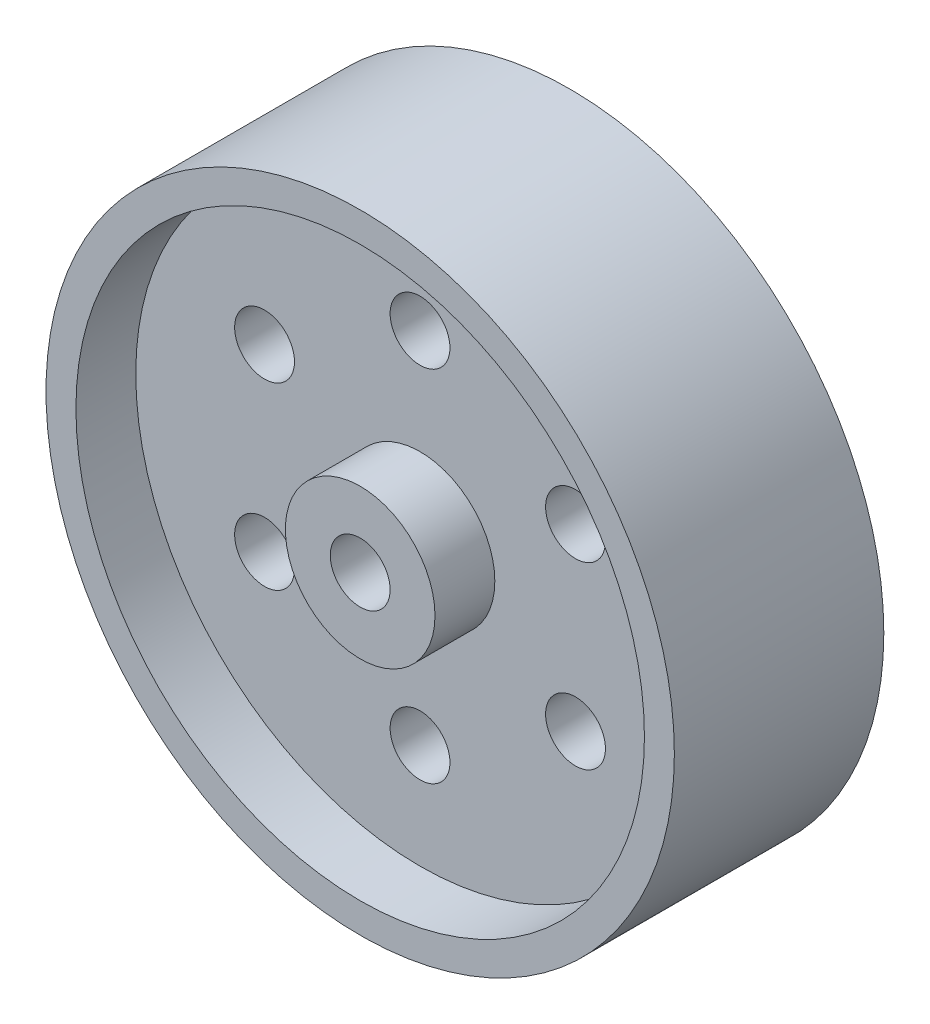
ISO-10303-21;
HEADER;
FILE_DESCRIPTION(('STEP AP214'),'2;1');
FILE_NAME('part.step','',(''),(''),'','','');
FILE_SCHEMA(('AUTOMOTIVE_DESIGN { 1 0 10303 214 1 1 1 1 }'));
ENDSEC;
DATA;
#1=APPLICATION_CONTEXT('core data for automotive mechanical design processes');
#2=APPLICATION_PROTOCOL_DEFINITION('international standard','automotive_design',2000,#1);
#3=PRODUCT_CONTEXT('',#1,'mechanical');
#4=PRODUCT('Part','Part','',(#3));
#5=PRODUCT_RELATED_PRODUCT_CATEGORY('part','',(#4));
#6=PRODUCT_DEFINITION_FORMATION('','',#4);
#7=PRODUCT_DEFINITION_CONTEXT('part definition',#1,'design');
#8=PRODUCT_DEFINITION('design','',#6,#7);
#9=PRODUCT_DEFINITION_SHAPE('','',#8);
#10=(LENGTH_UNIT() NAMED_UNIT(*) SI_UNIT(.MILLI.,.METRE.));
#11=(NAMED_UNIT(*) PLANE_ANGLE_UNIT() SI_UNIT($,.RADIAN.));
#12=(NAMED_UNIT(*) SI_UNIT($,.STERADIAN.) SOLID_ANGLE_UNIT());
#13=UNCERTAINTY_MEASURE_WITH_UNIT(LENGTH_MEASURE(1.E-05),#10,'distance_accuracy_value','');
#14=(GEOMETRIC_REPRESENTATION_CONTEXT(3) GLOBAL_UNCERTAINTY_ASSIGNED_CONTEXT((#13)) GLOBAL_UNIT_ASSIGNED_CONTEXT((#10,
#11,#12)) REPRESENTATION_CONTEXT('',''));
#15=CARTESIAN_POINT('',(0.,0.,0.));
#16=DIRECTION('',(0.,0.,1.));
#17=DIRECTION('',(1.,0.,0.));
#18=AXIS2_PLACEMENT_3D('',#15,#16,#17);
#19=CARTESIAN_POINT('',(0.,0.,26.8716640502355));
#20=DIRECTION('',(0.,0.,1.));
#21=DIRECTION('',(1.,0.,0.));
#22=AXIS2_PLACEMENT_3D('',#19,#20,#21);
#23=CYLINDRICAL_SURFACE('',#22,5.);
#24=CARTESIAN_POINT('',(0.,0.,7.));
#25=DIRECTION('',(0.,0.,1.));
#26=DIRECTION('',(1.,0.,0.));
#27=AXIS2_PLACEMENT_3D('',#24,#25,#26);
#28=CIRCLE('',#27,5.);
#29=CARTESIAN_POINT('',(5.,0.,7.));
#30=VERTEX_POINT('',#29);
#31=EDGE_CURVE('E10',#30,#30,#28,.T.);
#32=ORIENTED_EDGE('',*,*,#31,.F.);
#33=EDGE_LOOP('',(#32));
#34=FACE_BOUND('',#33,.T.);
#35=CARTESIAN_POINT('',(0.,0.,3.));
#36=DIRECTION('',(0.,0.,1.));
#37=DIRECTION('',(1.,0.,0.));
#38=AXIS2_PLACEMENT_3D('',#35,#36,#37);
#39=CIRCLE('',#38,5.);
#40=CARTESIAN_POINT('',(5.,0.,3.));
#41=VERTEX_POINT('',#40);
#42=EDGE_CURVE('E83',#41,#41,#39,.T.);
#43=ORIENTED_EDGE('',*,*,#42,.T.);
#44=EDGE_LOOP('',(#43));
#45=FACE_BOUND('',#44,.T.);
#46=ADVANCED_FACE('F35',(#34,#45),#23,.T.);
#47=CARTESIAN_POINT('',(0.,2.,7.));
#48=DIRECTION('',(0.,0.,-1.));
#49=DIRECTION('',(-1.,0.,0.));
#50=AXIS2_PLACEMENT_3D('',#47,#48,#49);
#51=PLANE('',#50);
#52=CARTESIAN_POINT('',(0.,0.,7.));
#53=DIRECTION('',(0.,0.,1.));
#54=DIRECTION('',(1.,0.,0.));
#55=AXIS2_PLACEMENT_3D('',#52,#53,#54);
#56=CIRCLE('',#55,2.);
#57=CARTESIAN_POINT('',(2.,0.,7.));
#58=VERTEX_POINT('',#57);
#59=EDGE_CURVE('E42',#58,#58,#56,.T.);
#60=ORIENTED_EDGE('',*,*,#59,.F.);
#61=EDGE_LOOP('',(#60));
#62=FACE_BOUND('',#61,.T.);
#63=ORIENTED_EDGE('',*,*,#31,.T.);
#64=EDGE_LOOP('',(#63));
#65=FACE_BOUND('',#64,.T.);
#66=ADVANCED_FACE('F111',(#62,#65),#51,.F.);
#67=CARTESIAN_POINT('',(0.,0.,26.8716640502355));
#68=DIRECTION('',(0.,0.,1.));
#69=DIRECTION('',(1.,0.,0.));
#70=AXIS2_PLACEMENT_3D('',#67,#68,#69);
#71=CYLINDRICAL_SURFACE('',#70,2.);
#72=CARTESIAN_POINT('',(0.,0.,-3.));
#73=DIRECTION('',(0.,0.,1.));
#74=DIRECTION('',(1.,0.,0.));
#75=AXIS2_PLACEMENT_3D('',#72,#73,#74);
#76=CIRCLE('',#75,2.);
#77=CARTESIAN_POINT('',(2.,0.,-3.));
#78=VERTEX_POINT('',#77);
#79=EDGE_CURVE('E47',#78,#78,#76,.T.);
#80=ORIENTED_EDGE('',*,*,#79,.F.);
#81=EDGE_LOOP('',(#80));
#82=FACE_BOUND('',#81,.T.);
#83=ORIENTED_EDGE('',*,*,#59,.T.);
#84=EDGE_LOOP('',(#83));
#85=FACE_BOUND('',#84,.T.);
#86=ADVANCED_FACE('F108',(#82,#85),#71,.F.);
#87=CARTESIAN_POINT('',(0.,2.,-3.));
#88=DIRECTION('',(0.,0.,1.));
#89=DIRECTION('',(1.,0.,0.));
#90=AXIS2_PLACEMENT_3D('',#87,#88,#89);
#91=PLANE('',#90);
#92=CARTESIAN_POINT('',(0.,12.,-3.));
#93=DIRECTION('',(0.,0.,1.));
#94=DIRECTION('',(1.,0.,0.));
#95=AXIS2_PLACEMENT_3D('',#92,#93,#94);
#96=CIRCLE('',#95,2.);
#97=CARTESIAN_POINT('',(2.,12.,-3.));
#98=VERTEX_POINT('',#97);
#99=EDGE_CURVE('E80',#98,#98,#96,.T.);
#100=ORIENTED_EDGE('',*,*,#99,.T.);
#101=EDGE_LOOP('',(#100));
#102=FACE_BOUND('',#101,.T.);
#103=CARTESIAN_POINT('',(-10.392304845413,5.99999999999955,-3.));
#104=DIRECTION('',(0.,0.,1.));
#105=DIRECTION('',(1.,0.,0.));
#106=AXIS2_PLACEMENT_3D('',#103,#104,#105);
#107=CIRCLE('',#106,2.00000000000052);
#108=CARTESIAN_POINT('',(-8.3923048454125,5.99999999999955,-3.));
#109=VERTEX_POINT('',#108);
#110=EDGE_CURVE('E68',#109,#109,#107,.T.);
#111=ORIENTED_EDGE('',*,*,#110,.T.);
#112=EDGE_LOOP('',(#111));
#113=FACE_BOUND('',#112,.T.);
#114=CARTESIAN_POINT('',(-10.3923048454125,-6.00000000000045,-3.));
#115=DIRECTION('',(0.,0.,1.));
#116=DIRECTION('',(1.,0.,0.));
#117=AXIS2_PLACEMENT_3D('',#114,#115,#116);
#118=CIRCLE('',#117,2.00000000000097);
#119=CARTESIAN_POINT('',(-8.39230484541153,-6.00000000000045,-3.));
#120=VERTEX_POINT('',#119);
#121=EDGE_CURVE('E65',#120,#120,#118,.T.);
#122=ORIENTED_EDGE('',*,*,#121,.T.);
#123=EDGE_LOOP('',(#122));
#124=FACE_BOUND('',#123,.T.);
#125=CARTESIAN_POINT('',(1.01877281101761E-12,-12.,-3.));
#126=DIRECTION('',(0.,0.,1.));
#127=DIRECTION('',(1.,0.,0.));
#128=AXIS2_PLACEMENT_3D('',#125,#126,#127);
#129=CIRCLE('',#128,2.00000000000105);
#130=CARTESIAN_POINT('',(2.00000000000207,-12.,-3.));
#131=VERTEX_POINT('',#130);
#132=EDGE_CURVE('E62',#131,#131,#129,.T.);
#133=ORIENTED_EDGE('',*,*,#132,.T.);
#134=EDGE_LOOP('',(#133));
#135=FACE_BOUND('',#134,.T.);
#136=CARTESIAN_POINT('',(10.392304845414,-5.99999999999956,-3.));
#137=DIRECTION('',(0.,0.,1.));
#138=DIRECTION('',(1.,0.,0.));
#139=AXIS2_PLACEMENT_3D('',#136,#137,#138);
#140=CIRCLE('',#139,2.00000000000066);
#141=CARTESIAN_POINT('',(12.3923048454147,-5.99999999999956,-3.));
#142=VERTEX_POINT('',#141);
#143=EDGE_CURVE('E58',#142,#142,#140,.T.);
#144=ORIENTED_EDGE('',*,*,#143,.T.);
#145=EDGE_LOOP('',(#144));
#146=FACE_BOUND('',#145,.T.);
#147=CARTESIAN_POINT('',(10.3923048454135,6.00000000000045,-3.));
#148=DIRECTION('',(0.,0.,1.));
#149=DIRECTION('',(1.,0.,0.));
#150=AXIS2_PLACEMENT_3D('',#147,#148,#149);
#151=CIRCLE('',#150,2.00000000000014);
#152=CARTESIAN_POINT('',(12.3923048454137,6.00000000000045,-3.));
#153=VERTEX_POINT('',#152);
#154=EDGE_CURVE('E54',#153,#153,#151,.T.);
#155=ORIENTED_EDGE('',*,*,#154,.T.);
#156=EDGE_LOOP('',(#155));
#157=FACE_BOUND('',#156,.T.);
#158=CARTESIAN_POINT('',(0.,0.,-3.));
#159=DIRECTION('',(0.,0.,1.));
#160=DIRECTION('',(1.,0.,0.));
#161=AXIS2_PLACEMENT_3D('',#158,#159,#160);
#162=CIRCLE('',#161,15.);
#163=CARTESIAN_POINT('',(15.,0.,-3.));
#164=VERTEX_POINT('',#163);
#165=EDGE_CURVE('E101',#164,#164,#162,.T.);
#166=ORIENTED_EDGE('',*,*,#165,.F.);
#167=EDGE_LOOP('',(#166));
#168=FACE_BOUND('',#167,.T.);
#169=ORIENTED_EDGE('',*,*,#79,.T.);
#170=EDGE_LOOP('',(#169));
#171=FACE_BOUND('',#170,.T.);
#172=ADVANCED_FACE('F106',(#102,#113,#124,#135,#146,#157,#168,#171),#91,.F.);
#173=CARTESIAN_POINT('',(0.,0.,26.8716640502355));
#174=DIRECTION('',(0.,0.,1.));
#175=DIRECTION('',(1.,0.,0.));
#176=AXIS2_PLACEMENT_3D('',#173,#174,#175);
#177=CYLINDRICAL_SURFACE('',#176,15.);
#178=CARTESIAN_POINT('',(0.,0.,-7.));
#179=DIRECTION('',(0.,0.,1.));
#180=DIRECTION('',(1.,0.,0.));
#181=AXIS2_PLACEMENT_3D('',#178,#179,#180);
#182=CIRCLE('',#181,15.);
#183=CARTESIAN_POINT('',(15.,0.,-7.));
#184=VERTEX_POINT('',#183);
#185=EDGE_CURVE('E98',#184,#184,#182,.T.);
#186=ORIENTED_EDGE('',*,*,#185,.F.);
#187=EDGE_LOOP('',(#186));
#188=FACE_BOUND('',#187,.T.);
#189=ORIENTED_EDGE('',*,*,#165,.T.);
#190=EDGE_LOOP('',(#189));
#191=FACE_BOUND('',#190,.T.);
#192=ADVANCED_FACE('F123',(#188,#191),#177,.F.);
#193=CARTESIAN_POINT('',(0.,21.,-7.));
#194=DIRECTION('',(0.,0.,1.));
#195=DIRECTION('',(1.,0.,0.));
#196=AXIS2_PLACEMENT_3D('',#193,#194,#195);
#197=PLANE('',#196);
#198=CARTESIAN_POINT('',(0.,0.,-7.));
#199=DIRECTION('',(0.,0.,1.));
#200=DIRECTION('',(1.,0.,0.));
#201=AXIS2_PLACEMENT_3D('',#198,#199,#200);
#202=CIRCLE('',#201,21.);
#203=CARTESIAN_POINT('',(21.,0.,-7.));
#204=VERTEX_POINT('',#203);
#205=EDGE_CURVE('E95',#204,#204,#202,.T.);
#206=ORIENTED_EDGE('',*,*,#205,.F.);
#207=EDGE_LOOP('',(#206));
#208=FACE_BOUND('',#207,.T.);
#209=ORIENTED_EDGE('',*,*,#185,.T.);
#210=EDGE_LOOP('',(#209));
#211=FACE_BOUND('',#210,.T.);
#212=ADVANCED_FACE('F127',(#208,#211),#197,.F.);
#213=CARTESIAN_POINT('',(0.,0.,26.8716640502355));
#214=DIRECTION('',(0.,0.,1.));
#215=DIRECTION('',(1.,0.,0.));
#216=AXIS2_PLACEMENT_3D('',#213,#214,#215);
#217=CYLINDRICAL_SURFACE('',#216,21.);
#218=CARTESIAN_POINT('',(0.,0.,7.));
#219=DIRECTION('',(0.,0.,1.));
#220=DIRECTION('',(1.,0.,0.));
#221=AXIS2_PLACEMENT_3D('',#218,#219,#220);
#222=CIRCLE('',#221,21.);
#223=CARTESIAN_POINT('',(21.,0.,7.));
#224=VERTEX_POINT('',#223);
#225=EDGE_CURVE('E92',#224,#224,#222,.T.);
#226=ORIENTED_EDGE('',*,*,#225,.F.);
#227=EDGE_LOOP('',(#226));
#228=FACE_BOUND('',#227,.T.);
#229=ORIENTED_EDGE('',*,*,#205,.T.);
#230=EDGE_LOOP('',(#229));
#231=FACE_BOUND('',#230,.T.);
#232=ADVANCED_FACE('F131',(#228,#231),#217,.T.);
#233=CARTESIAN_POINT('',(0.,19.,7.));
#234=DIRECTION('',(0.,0.,-1.));
#235=DIRECTION('',(-1.,0.,0.));
#236=AXIS2_PLACEMENT_3D('',#233,#234,#235);
#237=PLANE('',#236);
#238=CARTESIAN_POINT('',(0.,0.,7.));
#239=DIRECTION('',(0.,0.,1.));
#240=DIRECTION('',(1.,0.,0.));
#241=AXIS2_PLACEMENT_3D('',#238,#239,#240);
#242=CIRCLE('',#241,19.);
#243=CARTESIAN_POINT('',(19.,0.,7.));
#244=VERTEX_POINT('',#243);
#245=EDGE_CURVE('E89',#244,#244,#242,.T.);
#246=ORIENTED_EDGE('',*,*,#245,.F.);
#247=EDGE_LOOP('',(#246));
#248=FACE_BOUND('',#247,.T.);
#249=ORIENTED_EDGE('',*,*,#225,.T.);
#250=EDGE_LOOP('',(#249));
#251=FACE_BOUND('',#250,.T.);
#252=ADVANCED_FACE('F135',(#248,#251),#237,.F.);
#253=CARTESIAN_POINT('',(0.,0.,26.8716640502355));
#254=DIRECTION('',(0.,0.,1.));
#255=DIRECTION('',(1.,0.,0.));
#256=AXIS2_PLACEMENT_3D('',#253,#254,#255);
#257=CYLINDRICAL_SURFACE('',#256,19.);
#258=CARTESIAN_POINT('',(0.,0.,3.));
#259=DIRECTION('',(0.,0.,1.));
#260=DIRECTION('',(1.,0.,0.));
#261=AXIS2_PLACEMENT_3D('',#258,#259,#260);
#262=CIRCLE('',#261,19.);
#263=CARTESIAN_POINT('',(19.,0.,3.));
#264=VERTEX_POINT('',#263);
#265=EDGE_CURVE('E86',#264,#264,#262,.T.);
#266=ORIENTED_EDGE('',*,*,#265,.F.);
#267=EDGE_LOOP('',(#266));
#268=FACE_BOUND('',#267,.T.);
#269=ORIENTED_EDGE('',*,*,#245,.T.);
#270=EDGE_LOOP('',(#269));
#271=FACE_BOUND('',#270,.T.);
#272=ADVANCED_FACE('F139',(#268,#271),#257,.F.);
#273=CARTESIAN_POINT('',(0.,5.,3.));
#274=DIRECTION('',(0.,0.,-1.));
#275=DIRECTION('',(-1.,0.,0.));
#276=AXIS2_PLACEMENT_3D('',#273,#274,#275);
#277=PLANE('',#276);
#278=CARTESIAN_POINT('',(0.,12.,3.));
#279=DIRECTION('',(0.,0.,-1.));
#280=DIRECTION('',(-1.,0.,0.));
#281=AXIS2_PLACEMENT_3D('',#278,#279,#280);
#282=CIRCLE('',#281,2.);
#283=CARTESIAN_POINT('',(-2.,12.,3.));
#284=VERTEX_POINT('',#283);
#285=EDGE_CURVE('E38',#284,#284,#282,.T.);
#286=ORIENTED_EDGE('',*,*,#285,.T.);
#287=EDGE_LOOP('',(#286));
#288=FACE_BOUND('',#287,.T.);
#289=CARTESIAN_POINT('',(-10.392304845413,5.99999999999955,3.));
#290=DIRECTION('',(0.,0.,-1.));
#291=DIRECTION('',(-1.,0.,0.));
#292=AXIS2_PLACEMENT_3D('',#289,#290,#291);
#293=CIRCLE('',#292,2.00000000000052);
#294=CARTESIAN_POINT('',(-12.3923048454135,5.99999999999955,3.));
#295=VERTEX_POINT('',#294);
#296=EDGE_CURVE('E66',#295,#295,#293,.T.);
#297=ORIENTED_EDGE('',*,*,#296,.T.);
#298=EDGE_LOOP('',(#297));
#299=FACE_BOUND('',#298,.T.);
#300=CARTESIAN_POINT('',(-10.3923048454125,-6.00000000000045,3.));
#301=DIRECTION('',(0.,0.,-1.));
#302=DIRECTION('',(-1.,0.,0.));
#303=AXIS2_PLACEMENT_3D('',#300,#301,#302);
#304=CIRCLE('',#303,2.00000000000097);
#305=CARTESIAN_POINT('',(-12.3923048454135,-6.00000000000045,3.));
#306=VERTEX_POINT('',#305);
#307=EDGE_CURVE('E63',#306,#306,#304,.T.);
#308=ORIENTED_EDGE('',*,*,#307,.T.);
#309=EDGE_LOOP('',(#308));
#310=FACE_BOUND('',#309,.T.);
#311=CARTESIAN_POINT('',(1.01877281101761E-12,-12.,3.));
#312=DIRECTION('',(0.,0.,-1.));
#313=DIRECTION('',(-1.,0.,0.));
#314=AXIS2_PLACEMENT_3D('',#311,#312,#313);
#315=CIRCLE('',#314,2.00000000000105);
#316=CARTESIAN_POINT('',(-2.00000000000004,-12.,3.));
#317=VERTEX_POINT('',#316);
#318=EDGE_CURVE('E59',#317,#317,#315,.T.);
#319=ORIENTED_EDGE('',*,*,#318,.T.);
#320=EDGE_LOOP('',(#319));
#321=FACE_BOUND('',#320,.T.);
#322=CARTESIAN_POINT('',(10.392304845414,-5.99999999999956,3.));
#323=DIRECTION('',(0.,0.,-1.));
#324=DIRECTION('',(-1.,0.,0.));
#325=AXIS2_PLACEMENT_3D('',#322,#323,#324);
#326=CIRCLE('',#325,2.00000000000066);
#327=CARTESIAN_POINT('',(8.39230484541337,-5.99999999999956,3.));
#328=VERTEX_POINT('',#327);
#329=EDGE_CURVE('E55',#328,#328,#326,.T.);
#330=ORIENTED_EDGE('',*,*,#329,.T.);
#331=EDGE_LOOP('',(#330));
#332=FACE_BOUND('',#331,.T.);
#333=CARTESIAN_POINT('',(10.3923048454135,6.00000000000045,3.));
#334=DIRECTION('',(0.,0.,-1.));
#335=DIRECTION('',(-1.,0.,0.));
#336=AXIS2_PLACEMENT_3D('',#333,#334,#335);
#337=CIRCLE('',#336,2.00000000000014);
#338=CARTESIAN_POINT('',(8.39230484541337,6.00000000000045,3.));
#339=VERTEX_POINT('',#338);
#340=EDGE_CURVE('E51',#339,#339,#337,.T.);
#341=ORIENTED_EDGE('',*,*,#340,.T.);
#342=EDGE_LOOP('',(#341));
#343=FACE_BOUND('',#342,.T.);
#344=ORIENTED_EDGE('',*,*,#42,.F.);
#345=EDGE_LOOP('',(#344));
#346=FACE_BOUND('',#345,.T.);
#347=ORIENTED_EDGE('',*,*,#265,.T.);
#348=EDGE_LOOP('',(#347));
#349=FACE_BOUND('',#348,.T.);
#350=ADVANCED_FACE('F143',(#288,#299,#310,#321,#332,#343,#346,#349),#277,.F.);
#351=CARTESIAN_POINT('',(10.3923048454135,6.00000000000045,-7.));
#352=DIRECTION('',(0.,0.,1.));
#353=DIRECTION('',(1.,0.,0.));
#354=AXIS2_PLACEMENT_3D('',#351,#352,#353);
#355=CYLINDRICAL_SURFACE('',#354,2.00000000000014);
#356=ORIENTED_EDGE('',*,*,#340,.F.);
#357=EDGE_LOOP('',(#356));
#358=FACE_BOUND('',#357,.T.);
#359=ORIENTED_EDGE('',*,*,#154,.F.);
#360=EDGE_LOOP('',(#359));
#361=FACE_BOUND('',#360,.T.);
#362=ADVANCED_FACE('F147',(#358,#361),#355,.F.);
#363=CARTESIAN_POINT('',(10.392304845414,-5.99999999999956,-7.));
#364=DIRECTION('',(0.,0.,1.));
#365=DIRECTION('',(1.,0.,0.));
#366=AXIS2_PLACEMENT_3D('',#363,#364,#365);
#367=CYLINDRICAL_SURFACE('',#366,2.00000000000066);
#368=ORIENTED_EDGE('',*,*,#329,.F.);
#369=EDGE_LOOP('',(#368));
#370=FACE_BOUND('',#369,.T.);
#371=ORIENTED_EDGE('',*,*,#143,.F.);
#372=EDGE_LOOP('',(#371));
#373=FACE_BOUND('',#372,.T.);
#374=ADVANCED_FACE('F157',(#370,#373),#367,.F.);
#375=CARTESIAN_POINT('',(1.01877281101761E-12,-12.,-7.));
#376=DIRECTION('',(0.,0.,1.));
#377=DIRECTION('',(1.,0.,0.));
#378=AXIS2_PLACEMENT_3D('',#375,#376,#377);
#379=CYLINDRICAL_SURFACE('',#378,2.00000000000105);
#380=ORIENTED_EDGE('',*,*,#318,.F.);
#381=EDGE_LOOP('',(#380));
#382=FACE_BOUND('',#381,.T.);
#383=ORIENTED_EDGE('',*,*,#132,.F.);
#384=EDGE_LOOP('',(#383));
#385=FACE_BOUND('',#384,.T.);
#386=ADVANCED_FACE('F153',(#382,#385),#379,.F.);
#387=CARTESIAN_POINT('',(-10.3923048454125,-6.00000000000045,-7.));
#388=DIRECTION('',(0.,0.,1.));
#389=DIRECTION('',(1.,0.,0.));
#390=AXIS2_PLACEMENT_3D('',#387,#388,#389);
#391=CYLINDRICAL_SURFACE('',#390,2.00000000000097);
#392=ORIENTED_EDGE('',*,*,#307,.F.);
#393=EDGE_LOOP('',(#392));
#394=FACE_BOUND('',#393,.T.);
#395=ORIENTED_EDGE('',*,*,#121,.F.);
#396=EDGE_LOOP('',(#395));
#397=FACE_BOUND('',#396,.T.);
#398=ADVANCED_FACE('F149',(#394,#397),#391,.F.);
#399=CARTESIAN_POINT('',(-10.392304845413,5.99999999999955,-7.));
#400=DIRECTION('',(0.,0.,1.));
#401=DIRECTION('',(1.,0.,0.));
#402=AXIS2_PLACEMENT_3D('',#399,#400,#401);
#403=CYLINDRICAL_SURFACE('',#402,2.00000000000052);
#404=ORIENTED_EDGE('',*,*,#296,.F.);
#405=EDGE_LOOP('',(#404));
#406=FACE_BOUND('',#405,.T.);
#407=ORIENTED_EDGE('',*,*,#110,.F.);
#408=EDGE_LOOP('',(#407));
#409=FACE_BOUND('',#408,.T.);
#410=ADVANCED_FACE('F152',(#406,#409),#403,.F.);
#411=CARTESIAN_POINT('',(0.,12.,-7.));
#412=DIRECTION('',(0.,0.,1.));
#413=DIRECTION('',(1.,0.,0.));
#414=AXIS2_PLACEMENT_3D('',#411,#412,#413);
#415=CYLINDRICAL_SURFACE('',#414,2.);
#416=ORIENTED_EDGE('',*,*,#285,.F.);
#417=EDGE_LOOP('',(#416));
#418=FACE_BOUND('',#417,.T.);
#419=ORIENTED_EDGE('',*,*,#99,.F.);
#420=EDGE_LOOP('',(#419));
#421=FACE_BOUND('',#420,.T.);
#422=ADVANCED_FACE('F167',(#418,#421),#415,.F.);
#423=CLOSED_SHELL('',(#46,#66,#86,#172,#192,#212,#232,#252,#272,#350,#362,#374,#386,#398,#410,#422));
#424=MANIFOLD_SOLID_BREP('B2',#423);
#425=ADVANCED_BREP_SHAPE_REPRESENTATION('',(#18,#424),#14);
#426=SHAPE_DEFINITION_REPRESENTATION(#9,#425);
ENDSEC;
END-ISO-10303-21;
